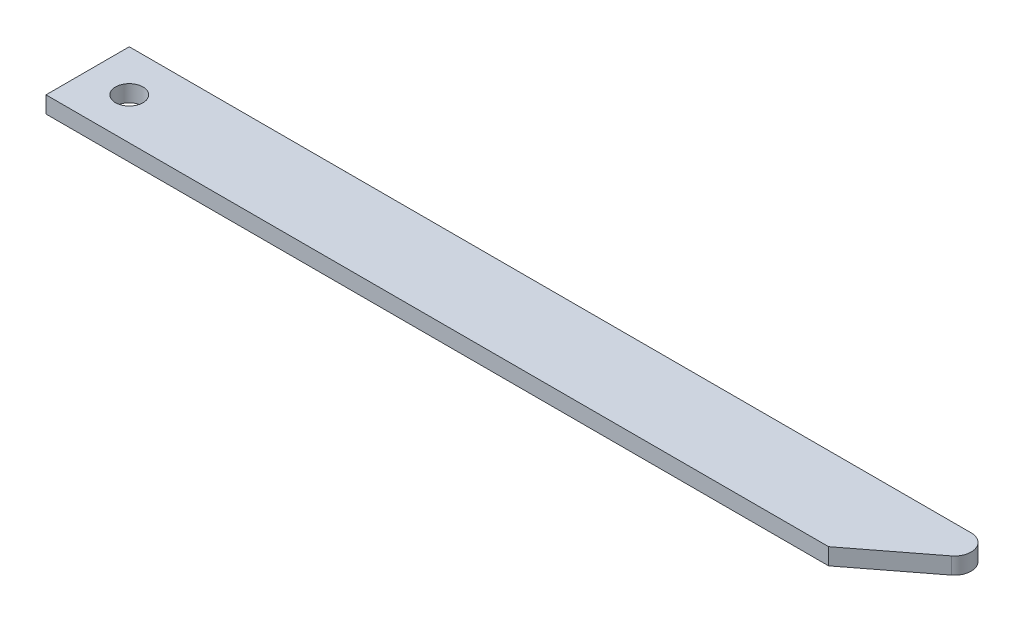
ISO-10303-21;
HEADER;
FILE_DESCRIPTION(('STEP AP214'),'2;1');
FILE_NAME('part.step','',(''),(''),'','','');
FILE_SCHEMA(('AUTOMOTIVE_DESIGN { 1 0 10303 214 1 1 1 1 }'));
ENDSEC;
DATA;
#1=APPLICATION_CONTEXT('core data for automotive mechanical design processes');
#2=APPLICATION_PROTOCOL_DEFINITION('international standard','automotive_design',2000,#1);
#3=PRODUCT_CONTEXT('',#1,'mechanical');
#4=PRODUCT('Part','Part','',(#3));
#5=PRODUCT_RELATED_PRODUCT_CATEGORY('part','',(#4));
#6=PRODUCT_DEFINITION_FORMATION('','',#4);
#7=PRODUCT_DEFINITION_CONTEXT('part definition',#1,'design');
#8=PRODUCT_DEFINITION('design','',#6,#7);
#9=PRODUCT_DEFINITION_SHAPE('','',#8);
#10=(LENGTH_UNIT() NAMED_UNIT(*) SI_UNIT(.MILLI.,.METRE.));
#11=(NAMED_UNIT(*) PLANE_ANGLE_UNIT() SI_UNIT($,.RADIAN.));
#12=(NAMED_UNIT(*) SI_UNIT($,.STERADIAN.) SOLID_ANGLE_UNIT());
#13=UNCERTAINTY_MEASURE_WITH_UNIT(LENGTH_MEASURE(1.E-05),#10,'distance_accuracy_value','');
#14=(GEOMETRIC_REPRESENTATION_CONTEXT(3) GLOBAL_UNCERTAINTY_ASSIGNED_CONTEXT((#13)) GLOBAL_UNIT_ASSIGNED_CONTEXT((#10,
#11,#12)) REPRESENTATION_CONTEXT('',''));
#15=CARTESIAN_POINT('',(0.,0.,0.));
#16=DIRECTION('',(0.,0.,1.));
#17=DIRECTION('',(1.,0.,0.));
#18=AXIS2_PLACEMENT_3D('',#15,#16,#17);
#19=CARTESIAN_POINT('',(-119.38,2.54,-12.7));
#20=DIRECTION('',(0.,0.,1.));
#21=DIRECTION('',(1.,0.,0.));
#22=AXIS2_PLACEMENT_3D('',#19,#20,#21);
#23=PLANE('',#22);
#24=DIRECTION('',(-1.,0.,0.));
#25=VECTOR('',#24,1.);
#26=CARTESIAN_POINT('',(-119.38,0.,-12.7));
#27=LINE('',#26,#25);
#28=CARTESIAN_POINT('',(9.04209025541829,0.,-12.7));
#29=VERTEX_POINT('',#28);
#30=CARTESIAN_POINT('',(-119.38,0.,-12.7));
#31=VERTEX_POINT('',#30);
#32=EDGE_CURVE('E111',#29,#31,#27,.T.);
#33=ORIENTED_EDGE('',*,*,#32,.T.);
#34=DIRECTION('',(0.,-1.,0.));
#35=VECTOR('',#34,1.);
#36=CARTESIAN_POINT('',(-119.38,2.54,-12.7));
#37=LINE('',#36,#35);
#38=CARTESIAN_POINT('',(-119.38,2.54,-12.7));
#39=VERTEX_POINT('',#38);
#40=EDGE_CURVE('E11',#39,#31,#37,.T.);
#41=ORIENTED_EDGE('',*,*,#40,.F.);
#42=DIRECTION('',(-1.,0.,0.));
#43=VECTOR('',#42,1.);
#44=CARTESIAN_POINT('',(-119.38,2.54,-12.7));
#45=LINE('',#44,#43);
#46=CARTESIAN_POINT('',(9.04209025541829,2.54,-12.7));
#47=VERTEX_POINT('',#46);
#48=EDGE_CURVE('E120',#47,#39,#45,.T.);
#49=ORIENTED_EDGE('',*,*,#48,.F.);
#50=DIRECTION('',(0.,-1.,0.));
#51=VECTOR('',#50,1.);
#52=CARTESIAN_POINT('',(9.04209025541829,2.54,-12.7));
#53=LINE('',#52,#51);
#54=EDGE_CURVE('E107',#47,#29,#53,.T.);
#55=ORIENTED_EDGE('',*,*,#54,.T.);
#56=EDGE_LOOP('',(#33,#41,#49,#55));
#57=FACE_BOUND('',#56,.T.);
#58=ADVANCED_FACE('F37',(#57),#23,.F.);
#59=CARTESIAN_POINT('',(-119.38,2.54,0.));
#60=DIRECTION('',(1.,0.,0.));
#61=DIRECTION('',(0.,0.,-1.));
#62=AXIS2_PLACEMENT_3D('',#59,#60,#61);
#63=PLANE('',#62);
#64=DIRECTION('',(0.,0.,1.));
#65=VECTOR('',#64,1.);
#66=CARTESIAN_POINT('',(-119.38,0.,0.));
#67=LINE('',#66,#65);
#68=CARTESIAN_POINT('',(-119.38,0.,0.));
#69=VERTEX_POINT('',#68);
#70=EDGE_CURVE('E114',#31,#69,#67,.T.);
#71=ORIENTED_EDGE('',*,*,#70,.T.);
#72=DIRECTION('',(0.,-1.,0.));
#73=VECTOR('',#72,1.);
#74=CARTESIAN_POINT('',(-119.38,2.54,0.));
#75=LINE('',#74,#73);
#76=CARTESIAN_POINT('',(-119.38,2.54,0.));
#77=VERTEX_POINT('',#76);
#78=EDGE_CURVE('E45',#77,#69,#75,.T.);
#79=ORIENTED_EDGE('',*,*,#78,.F.);
#80=DIRECTION('',(0.,0.,1.));
#81=VECTOR('',#80,1.);
#82=CARTESIAN_POINT('',(-119.38,2.54,0.));
#83=LINE('',#82,#81);
#84=EDGE_CURVE('E87',#39,#77,#83,.T.);
#85=ORIENTED_EDGE('',*,*,#84,.F.);
#86=ORIENTED_EDGE('',*,*,#40,.T.);
#87=EDGE_LOOP('',(#71,#79,#85,#86));
#88=FACE_BOUND('',#87,.T.);
#89=ADVANCED_FACE('F140',(#88),#63,.F.);
#90=CARTESIAN_POINT('',(0.,2.54,0.));
#91=DIRECTION('',(0.,0.,-1.));
#92=DIRECTION('',(-1.,0.,0.));
#93=AXIS2_PLACEMENT_3D('',#90,#91,#92);
#94=PLANE('',#93);
#95=DIRECTION('',(1.,0.,0.));
#96=VECTOR('',#95,1.);
#97=CARTESIAN_POINT('',(0.,0.,0.));
#98=LINE('',#97,#96);
#99=CARTESIAN_POINT('',(0.,0.,0.));
#100=VERTEX_POINT('',#99);
#101=EDGE_CURVE('E102',#69,#100,#98,.T.);
#102=ORIENTED_EDGE('',*,*,#101,.T.);
#103=DIRECTION('',(0.,-1.,0.));
#104=VECTOR('',#103,1.);
#105=CARTESIAN_POINT('',(0.,2.54,0.));
#106=LINE('',#105,#104);
#107=CARTESIAN_POINT('',(0.,2.54,0.));
#108=VERTEX_POINT('',#107);
#109=EDGE_CURVE('E99',#108,#100,#106,.T.);
#110=ORIENTED_EDGE('',*,*,#109,.F.);
#111=DIRECTION('',(1.,0.,0.));
#112=VECTOR('',#111,1.);
#113=CARTESIAN_POINT('',(0.,2.54,0.));
#114=LINE('',#113,#112);
#115=EDGE_CURVE('E91',#77,#108,#114,.T.);
#116=ORIENTED_EDGE('',*,*,#115,.F.);
#117=ORIENTED_EDGE('',*,*,#78,.T.);
#118=EDGE_LOOP('',(#102,#110,#116,#117));
#119=FACE_BOUND('',#118,.T.);
#120=ADVANCED_FACE('F100',(#119),#94,.F.);
#121=CARTESIAN_POINT('',(10.5907555879765,2.54,-8.14673506767425));
#122=DIRECTION('',(-0.609710760849692,0.,-0.7926239891046));
#123=DIRECTION('',(-0.7926239891046,0.,0.609710760849692));
#124=AXIS2_PLACEMENT_3D('',#121,#122,#123);
#125=PLANE('',#124);
#126=DIRECTION('',(0.7926239891046,0.,-0.609710760849692));
#127=VECTOR('',#126,1.);
#128=CARTESIAN_POINT('',(10.5907555879765,0.,-8.14673506767425));
#129=LINE('',#128,#127);
#130=CARTESIAN_POINT('',(10.5907555879765,0.,-8.14673506767425));
#131=VERTEX_POINT('',#130);
#132=EDGE_CURVE('E73',#100,#131,#129,.T.);
#133=ORIENTED_EDGE('',*,*,#132,.T.);
#134=DIRECTION('',(0.,-1.,0.));
#135=VECTOR('',#134,1.);
#136=CARTESIAN_POINT('',(10.5907555879765,2.54,-8.14673506767425));
#137=LINE('',#136,#135);
#138=CARTESIAN_POINT('',(10.5907555879765,2.54,-8.14673506767425));
#139=VERTEX_POINT('',#138);
#140=EDGE_CURVE('E103',#139,#131,#137,.T.);
#141=ORIENTED_EDGE('',*,*,#140,.F.);
#142=DIRECTION('',(0.7926239891046,0.,-0.609710760849692));
#143=VECTOR('',#142,1.);
#144=CARTESIAN_POINT('',(10.5907555879765,2.54,-8.14673506767425));
#145=LINE('',#144,#143);
#146=EDGE_CURVE('E95',#108,#139,#145,.T.);
#147=ORIENTED_EDGE('',*,*,#146,.F.);
#148=ORIENTED_EDGE('',*,*,#109,.T.);
#149=EDGE_LOOP('',(#133,#141,#147,#148));
#150=FACE_BOUND('',#149,.T.);
#151=ADVANCED_FACE('F105',(#150),#125,.F.);
#152=CARTESIAN_POINT('',(9.04209025541837,2.54,-10.16));
#153=DIRECTION('',(0.,-1.,0.));
#154=DIRECTION('',(0.,0.,-1.));
#155=AXIS2_PLACEMENT_3D('',#152,#153,#154);
#156=CYLINDRICAL_SURFACE('',#155,2.54);
#157=CARTESIAN_POINT('',(9.04209025541837,0.,-10.16));
#158=DIRECTION('',(0.,1.,0.));
#159=DIRECTION('',(0.,0.,-1.));
#160=AXIS2_PLACEMENT_3D('',#157,#158,#159);
#161=CIRCLE('',#160,2.54);
#162=EDGE_CURVE('E79',#131,#29,#161,.T.);
#163=ORIENTED_EDGE('',*,*,#162,.T.);
#164=ORIENTED_EDGE('',*,*,#54,.F.);
#165=CARTESIAN_POINT('',(9.04209025541837,2.54,-10.16));
#166=DIRECTION('',(0.,1.,0.));
#167=DIRECTION('',(0.,0.,-1.));
#168=AXIS2_PLACEMENT_3D('',#165,#166,#167);
#169=CIRCLE('',#168,2.54);
#170=EDGE_CURVE('E53',#139,#47,#169,.T.);
#171=ORIENTED_EDGE('',*,*,#170,.F.);
#172=ORIENTED_EDGE('',*,*,#140,.T.);
#173=EDGE_LOOP('',(#163,#164,#171,#172));
#174=FACE_BOUND('',#173,.T.);
#175=ADVANCED_FACE('F128',(#174),#156,.T.);
#176=CARTESIAN_POINT('',(9.04209025541837,2.54,-10.16));
#177=DIRECTION('',(0.,-1.,0.));
#178=DIRECTION('',(0.,0.,-1.));
#179=AXIS2_PLACEMENT_3D('',#176,#177,#178);
#180=PLANE('',#179);
#181=CARTESIAN_POINT('',(-113.03,2.54,-6.34999999999999));
#182=DIRECTION('',(0.,1.,0.));
#183=DIRECTION('',(0.,0.,1.));
#184=AXIS2_PLACEMENT_3D('',#181,#182,#183);
#185=CIRCLE('',#184,2.0955);
#186=CARTESIAN_POINT('',(-113.03,2.54,-4.25449999999998));
#187=VERTEX_POINT('',#186);
#188=EDGE_CURVE('E191',#187,#187,#185,.T.);
#189=ORIENTED_EDGE('',*,*,#188,.F.);
#190=EDGE_LOOP('',(#189));
#191=FACE_BOUND('',#190,.T.);
#192=ORIENTED_EDGE('',*,*,#48,.T.);
#193=ORIENTED_EDGE('',*,*,#84,.T.);
#194=ORIENTED_EDGE('',*,*,#115,.T.);
#195=ORIENTED_EDGE('',*,*,#146,.T.);
#196=ORIENTED_EDGE('',*,*,#170,.T.);
#197=EDGE_LOOP('',(#192,#193,#194,#195,#196));
#198=FACE_BOUND('',#197,.T.);
#199=ADVANCED_FACE('F93',(#191,#198),#180,.F.);
#200=CARTESIAN_POINT('',(9.04209025541837,0.,-10.16));
#201=DIRECTION('',(0.,-1.,0.));
#202=DIRECTION('',(0.,0.,-1.));
#203=AXIS2_PLACEMENT_3D('',#200,#201,#202);
#204=PLANE('',#203);
#205=CARTESIAN_POINT('',(-113.03,0.,-6.34999999999999));
#206=DIRECTION('',(0.,1.,0.));
#207=DIRECTION('',(0.,0.,1.));
#208=AXIS2_PLACEMENT_3D('',#205,#206,#207);
#209=CIRCLE('',#208,2.0955);
#210=CARTESIAN_POINT('',(-113.03,0.,-4.25449999999998));
#211=VERTEX_POINT('',#210);
#212=EDGE_CURVE('E115',#211,#211,#209,.T.);
#213=ORIENTED_EDGE('',*,*,#212,.T.);
#214=EDGE_LOOP('',(#213));
#215=FACE_BOUND('',#214,.T.);
#216=ORIENTED_EDGE('',*,*,#32,.F.);
#217=ORIENTED_EDGE('',*,*,#162,.F.);
#218=ORIENTED_EDGE('',*,*,#132,.F.);
#219=ORIENTED_EDGE('',*,*,#101,.F.);
#220=ORIENTED_EDGE('',*,*,#70,.F.);
#221=EDGE_LOOP('',(#216,#217,#218,#219,#220));
#222=FACE_BOUND('',#221,.T.);
#223=ADVANCED_FACE('F124',(#215,#222),#204,.T.);
#224=CARTESIAN_POINT('',(-113.03,0.,-6.34999999999999));
#225=DIRECTION('',(0.,1.,0.));
#226=DIRECTION('',(0.,0.,1.));
#227=AXIS2_PLACEMENT_3D('',#224,#225,#226);
#228=CYLINDRICAL_SURFACE('',#227,2.0955);
#229=ORIENTED_EDGE('',*,*,#212,.F.);
#230=EDGE_LOOP('',(#229));
#231=FACE_BOUND('',#230,.T.);
#232=ORIENTED_EDGE('',*,*,#188,.T.);
#233=EDGE_LOOP('',(#232));
#234=FACE_BOUND('',#233,.T.);
#235=ADVANCED_FACE('F173',(#231,#234),#228,.F.);
#236=CLOSED_SHELL('',(#58,#89,#120,#151,#175,#199,#223,#235));
#237=MANIFOLD_SOLID_BREP('B2',#236);
#238=ADVANCED_BREP_SHAPE_REPRESENTATION('',(#18,#237),#14);
#239=SHAPE_DEFINITION_REPRESENTATION(#9,#238);
ENDSEC;
END-ISO-10303-21;
